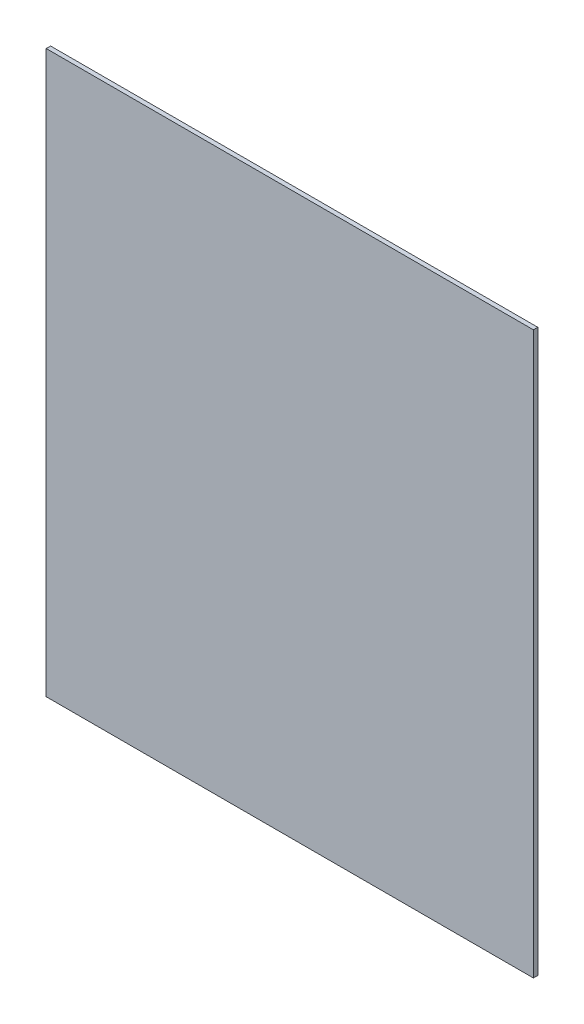
ISO-10303-21;
HEADER;
FILE_DESCRIPTION(('STEP AP214'),'2;1');
FILE_NAME('part.step','',(''),(''),'','','');
FILE_SCHEMA(('AUTOMOTIVE_DESIGN { 1 0 10303 214 1 1 1 1 }'));
ENDSEC;
DATA;
#1=APPLICATION_CONTEXT('core data for automotive mechanical design processes');
#2=APPLICATION_PROTOCOL_DEFINITION('international standard','automotive_design',2000,#1);
#3=PRODUCT_CONTEXT('',#1,'mechanical');
#4=PRODUCT('Part','Part','',(#3));
#5=PRODUCT_RELATED_PRODUCT_CATEGORY('part','',(#4));
#6=PRODUCT_DEFINITION_FORMATION('','',#4);
#7=PRODUCT_DEFINITION_CONTEXT('part definition',#1,'design');
#8=PRODUCT_DEFINITION('design','',#6,#7);
#9=PRODUCT_DEFINITION_SHAPE('','',#8);
#10=(LENGTH_UNIT() NAMED_UNIT(*) SI_UNIT(.MILLI.,.METRE.));
#11=(NAMED_UNIT(*) PLANE_ANGLE_UNIT() SI_UNIT($,.RADIAN.));
#12=(NAMED_UNIT(*) SI_UNIT($,.STERADIAN.) SOLID_ANGLE_UNIT());
#13=UNCERTAINTY_MEASURE_WITH_UNIT(LENGTH_MEASURE(1.E-05),#10,'distance_accuracy_value','');
#14=(GEOMETRIC_REPRESENTATION_CONTEXT(3) GLOBAL_UNCERTAINTY_ASSIGNED_CONTEXT((#13)) GLOBAL_UNIT_ASSIGNED_CONTEXT((#10,
#11,#12)) REPRESENTATION_CONTEXT('',''));
#15=CARTESIAN_POINT('',(0.,0.,0.));
#16=DIRECTION('',(0.,0.,1.));
#17=DIRECTION('',(1.,0.,0.));
#18=AXIS2_PLACEMENT_3D('',#15,#16,#17);
#19=CARTESIAN_POINT('',(361.,-416.,6.5));
#20=DIRECTION('',(-1.,0.,0.));
#21=DIRECTION('',(0.,0.,1.));
#22=AXIS2_PLACEMENT_3D('',#19,#20,#21);
#23=PLANE('',#22);
#24=DIRECTION('',(0.,1.,0.));
#25=VECTOR('',#24,1.);
#26=CARTESIAN_POINT('',(361.,-416.,0.));
#27=LINE('',#26,#25);
#28=CARTESIAN_POINT('',(361.,-416.,0.));
#29=VERTEX_POINT('',#28);
#30=CARTESIAN_POINT('',(361.,416.,0.));
#31=VERTEX_POINT('',#30);
#32=EDGE_CURVE('E95',#29,#31,#27,.T.);
#33=ORIENTED_EDGE('',*,*,#32,.T.);
#34=DIRECTION('',(0.,0.,-1.));
#35=VECTOR('',#34,1.);
#36=CARTESIAN_POINT('',(361.,416.,6.5));
#37=LINE('',#36,#35);
#38=CARTESIAN_POINT('',(361.,416.,6.5));
#39=VERTEX_POINT('',#38);
#40=EDGE_CURVE('E11',#39,#31,#37,.T.);
#41=ORIENTED_EDGE('',*,*,#40,.F.);
#42=DIRECTION('',(0.,1.,0.));
#43=VECTOR('',#42,1.);
#44=CARTESIAN_POINT('',(361.,-416.,6.5));
#45=LINE('',#44,#43);
#46=CARTESIAN_POINT('',(361.,-416.,6.5));
#47=VERTEX_POINT('',#46);
#48=EDGE_CURVE('E83',#47,#39,#45,.T.);
#49=ORIENTED_EDGE('',*,*,#48,.F.);
#50=DIRECTION('',(0.,0.,-1.));
#51=VECTOR('',#50,1.);
#52=CARTESIAN_POINT('',(361.,-416.,6.5));
#53=LINE('',#52,#51);
#54=EDGE_CURVE('E91',#47,#29,#53,.T.);
#55=ORIENTED_EDGE('',*,*,#54,.T.);
#56=EDGE_LOOP('',(#33,#41,#49,#55));
#57=FACE_BOUND('',#56,.T.);
#58=ADVANCED_FACE('F32',(#57),#23,.F.);
#59=CARTESIAN_POINT('',(-361.,416.,6.5));
#60=DIRECTION('',(0.,-1.,0.));
#61=DIRECTION('',(0.,0.,-1.));
#62=AXIS2_PLACEMENT_3D('',#59,#60,#61);
#63=PLANE('',#62);
#64=DIRECTION('',(-1.,0.,0.));
#65=VECTOR('',#64,1.);
#66=CARTESIAN_POINT('',(-361.,416.,0.));
#67=LINE('',#66,#65);
#68=CARTESIAN_POINT('',(-361.,416.,0.));
#69=VERTEX_POINT('',#68);
#70=EDGE_CURVE('E87',#31,#69,#67,.T.);
#71=ORIENTED_EDGE('',*,*,#70,.T.);
#72=DIRECTION('',(0.,0.,-1.));
#73=VECTOR('',#72,1.);
#74=CARTESIAN_POINT('',(-361.,416.,6.5));
#75=LINE('',#74,#73);
#76=CARTESIAN_POINT('',(-361.,416.,6.5));
#77=VERTEX_POINT('',#76);
#78=EDGE_CURVE('E40',#77,#69,#75,.T.);
#79=ORIENTED_EDGE('',*,*,#78,.F.);
#80=DIRECTION('',(-1.,0.,0.));
#81=VECTOR('',#80,1.);
#82=CARTESIAN_POINT('',(-361.,416.,6.5));
#83=LINE('',#82,#81);
#84=EDGE_CURVE('E78',#39,#77,#83,.T.);
#85=ORIENTED_EDGE('',*,*,#84,.F.);
#86=ORIENTED_EDGE('',*,*,#40,.T.);
#87=EDGE_LOOP('',(#71,#79,#85,#86));
#88=FACE_BOUND('',#87,.T.);
#89=ADVANCED_FACE('F86',(#88),#63,.F.);
#90=CARTESIAN_POINT('',(-361.,-416.,6.5));
#91=DIRECTION('',(1.,0.,0.));
#92=DIRECTION('',(0.,0.,-1.));
#93=AXIS2_PLACEMENT_3D('',#90,#91,#92);
#94=PLANE('',#93);
#95=DIRECTION('',(0.,-1.,0.));
#96=VECTOR('',#95,1.);
#97=CARTESIAN_POINT('',(-361.,-416.,0.));
#98=LINE('',#97,#96);
#99=CARTESIAN_POINT('',(-361.,-416.,0.));
#100=VERTEX_POINT('',#99);
#101=EDGE_CURVE('E65',#69,#100,#98,.T.);
#102=ORIENTED_EDGE('',*,*,#101,.T.);
#103=DIRECTION('',(0.,0.,-1.));
#104=VECTOR('',#103,1.);
#105=CARTESIAN_POINT('',(-361.,-416.,6.5));
#106=LINE('',#105,#104);
#107=CARTESIAN_POINT('',(-361.,-416.,6.5));
#108=VERTEX_POINT('',#107);
#109=EDGE_CURVE('E88',#108,#100,#106,.T.);
#110=ORIENTED_EDGE('',*,*,#109,.F.);
#111=DIRECTION('',(0.,-1.,0.));
#112=VECTOR('',#111,1.);
#113=CARTESIAN_POINT('',(-361.,-416.,6.5));
#114=LINE('',#113,#112);
#115=EDGE_CURVE('E81',#77,#108,#114,.T.);
#116=ORIENTED_EDGE('',*,*,#115,.F.);
#117=ORIENTED_EDGE('',*,*,#78,.T.);
#118=EDGE_LOOP('',(#102,#110,#116,#117));
#119=FACE_BOUND('',#118,.T.);
#120=ADVANCED_FACE('F89',(#119),#94,.F.);
#121=CARTESIAN_POINT('',(-361.,-416.,6.5));
#122=DIRECTION('',(0.,1.,0.));
#123=DIRECTION('',(0.,0.,1.));
#124=AXIS2_PLACEMENT_3D('',#121,#122,#123);
#125=PLANE('',#124);
#126=DIRECTION('',(1.,0.,0.));
#127=VECTOR('',#126,1.);
#128=CARTESIAN_POINT('',(-361.,-416.,0.));
#129=LINE('',#128,#127);
#130=EDGE_CURVE('E71',#100,#29,#129,.T.);
#131=ORIENTED_EDGE('',*,*,#130,.T.);
#132=ORIENTED_EDGE('',*,*,#54,.F.);
#133=DIRECTION('',(1.,0.,0.));
#134=VECTOR('',#133,1.);
#135=CARTESIAN_POINT('',(-361.,-416.,6.5));
#136=LINE('',#135,#134);
#137=EDGE_CURVE('E48',#108,#47,#136,.T.);
#138=ORIENTED_EDGE('',*,*,#137,.F.);
#139=ORIENTED_EDGE('',*,*,#109,.T.);
#140=EDGE_LOOP('',(#131,#132,#138,#139));
#141=FACE_BOUND('',#140,.T.);
#142=ADVANCED_FACE('F102',(#141),#125,.F.);
#143=CARTESIAN_POINT('',(0.,0.,6.5));
#144=DIRECTION('',(0.,0.,-1.));
#145=DIRECTION('',(-1.,0.,0.));
#146=AXIS2_PLACEMENT_3D('',#143,#144,#145);
#147=PLANE('',#146);
#148=ORIENTED_EDGE('',*,*,#48,.T.);
#149=ORIENTED_EDGE('',*,*,#84,.T.);
#150=ORIENTED_EDGE('',*,*,#115,.T.);
#151=ORIENTED_EDGE('',*,*,#137,.T.);
#152=EDGE_LOOP('',(#148,#149,#150,#151));
#153=FACE_BOUND('',#152,.T.);
#154=ADVANCED_FACE('F79',(#153),#147,.F.);
#155=CARTESIAN_POINT('',(0.,0.,0.));
#156=DIRECTION('',(0.,0.,-1.));
#157=DIRECTION('',(-1.,0.,0.));
#158=AXIS2_PLACEMENT_3D('',#155,#156,#157);
#159=PLANE('',#158);
#160=ORIENTED_EDGE('',*,*,#32,.F.);
#161=ORIENTED_EDGE('',*,*,#130,.F.);
#162=ORIENTED_EDGE('',*,*,#101,.F.);
#163=ORIENTED_EDGE('',*,*,#70,.F.);
#164=EDGE_LOOP('',(#160,#161,#162,#163));
#165=FACE_BOUND('',#164,.T.);
#166=ADVANCED_FACE('F105',(#165),#159,.T.);
#167=CLOSED_SHELL('',(#58,#89,#120,#142,#154,#166));
#168=MANIFOLD_SOLID_BREP('B2',#167);
#169=ADVANCED_BREP_SHAPE_REPRESENTATION('',(#18,#168),#14);
#170=SHAPE_DEFINITION_REPRESENTATION(#9,#169);
ENDSEC;
END-ISO-10303-21;
